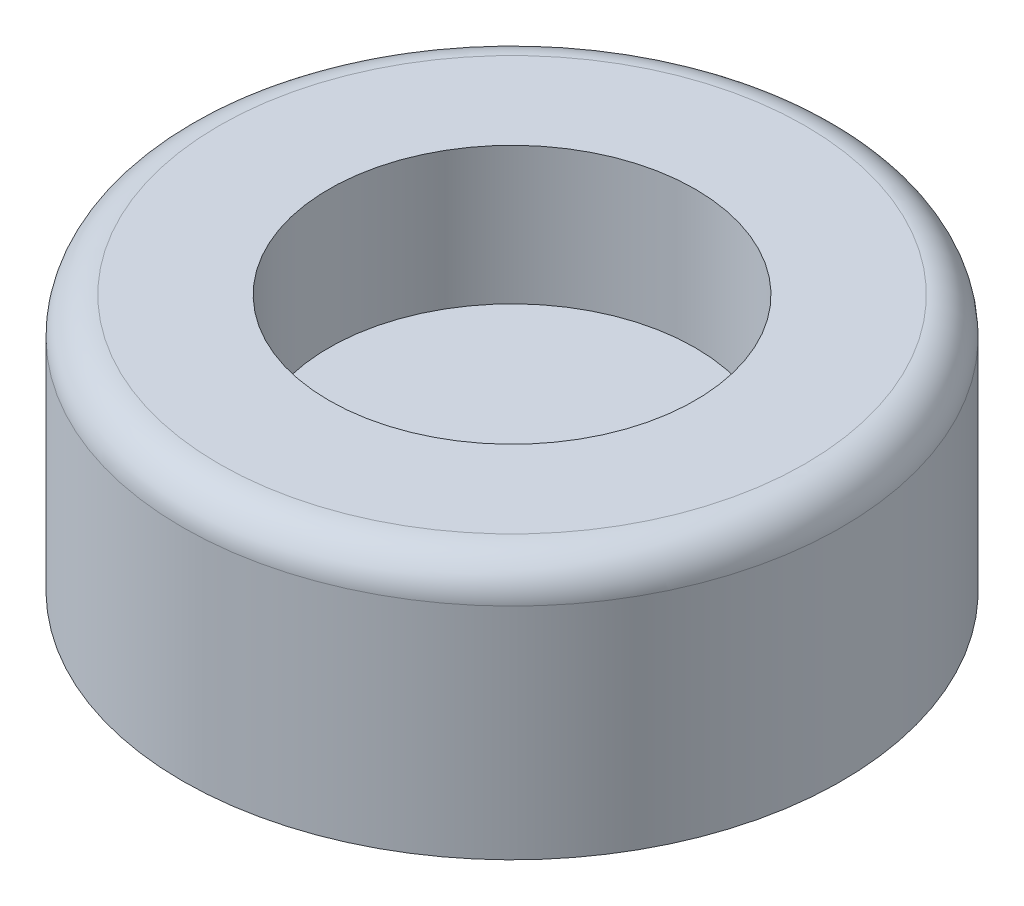
ISO-10303-21;
HEADER;
FILE_DESCRIPTION(('STEP AP214'),'2;1');
FILE_NAME('part.step','',(''),(''),'','','');
FILE_SCHEMA(('AUTOMOTIVE_DESIGN { 1 0 10303 214 1 1 1 1 }'));
ENDSEC;
DATA;
#1=APPLICATION_CONTEXT('core data for automotive mechanical design processes');
#2=APPLICATION_PROTOCOL_DEFINITION('international standard','automotive_design',2000,#1);
#3=PRODUCT_CONTEXT('',#1,'mechanical');
#4=PRODUCT('Part','Part','',(#3));
#5=PRODUCT_RELATED_PRODUCT_CATEGORY('part','',(#4));
#6=PRODUCT_DEFINITION_FORMATION('','',#4);
#7=PRODUCT_DEFINITION_CONTEXT('part definition',#1,'design');
#8=PRODUCT_DEFINITION('design','',#6,#7);
#9=PRODUCT_DEFINITION_SHAPE('','',#8);
#10=(LENGTH_UNIT() NAMED_UNIT(*) SI_UNIT(.MILLI.,.METRE.));
#11=(NAMED_UNIT(*) PLANE_ANGLE_UNIT() SI_UNIT($,.RADIAN.));
#12=(NAMED_UNIT(*) SI_UNIT($,.STERADIAN.) SOLID_ANGLE_UNIT());
#13=UNCERTAINTY_MEASURE_WITH_UNIT(LENGTH_MEASURE(1.E-05),#10,'distance_accuracy_value','');
#14=(GEOMETRIC_REPRESENTATION_CONTEXT(3) GLOBAL_UNCERTAINTY_ASSIGNED_CONTEXT((#13)) GLOBAL_UNIT_ASSIGNED_CONTEXT((#10,
#11,#12)) REPRESENTATION_CONTEXT('',''));
#15=CARTESIAN_POINT('',(0.,0.,0.));
#16=DIRECTION('',(0.,0.,1.));
#17=DIRECTION('',(1.,0.,0.));
#18=AXIS2_PLACEMENT_3D('',#15,#16,#17);
#19=CARTESIAN_POINT('',(0.,8.89,0.));
#20=DIRECTION('',(0.,-1.,0.));
#21=DIRECTION('',(0.,0.,-1.));
#22=AXIS2_PLACEMENT_3D('',#19,#20,#21);
#23=CYLINDRICAL_SURFACE('',#22,11.43);
#24=CARTESIAN_POINT('',(0.,7.62,0.));
#25=DIRECTION('',(0.,1.,0.));
#26=DIRECTION('',(0.,0.,1.));
#27=AXIS2_PLACEMENT_3D('',#24,#25,#26);
#28=CIRCLE('',#27,11.43);
#29=CARTESIAN_POINT('',(0.,7.62,11.43));
#30=VERTEX_POINT('',#29);
#31=EDGE_CURVE('E10',#30,#30,#28,.F.);
#32=ORIENTED_EDGE('',*,*,#31,.T.);
#33=EDGE_LOOP('',(#32));
#34=FACE_BOUND('',#33,.T.);
#35=CARTESIAN_POINT('',(0.,0.,0.));
#36=DIRECTION('',(0.,1.,0.));
#37=DIRECTION('',(0.,0.,1.));
#38=AXIS2_PLACEMENT_3D('',#35,#36,#37);
#39=CIRCLE('',#38,11.43);
#40=CARTESIAN_POINT('',(0.,0.,11.43));
#41=VERTEX_POINT('',#40);
#42=EDGE_CURVE('E50',#41,#41,#39,.T.);
#43=ORIENTED_EDGE('',*,*,#42,.T.);
#44=EDGE_LOOP('',(#43));
#45=FACE_BOUND('',#44,.T.);
#46=ADVANCED_FACE('F37',(#34,#45),#23,.T.);
#47=CARTESIAN_POINT('',(0.,8.89,0.));
#48=DIRECTION('',(0.,1.,0.));
#49=DIRECTION('',(0.,0.,1.));
#50=AXIS2_PLACEMENT_3D('',#47,#48,#49);
#51=PLANE('',#50);
#52=CARTESIAN_POINT('',(0.,8.89,0.));
#53=DIRECTION('',(0.,1.,0.));
#54=DIRECTION('',(0.,0.,1.));
#55=AXIS2_PLACEMENT_3D('',#52,#53,#54);
#56=CIRCLE('',#55,10.16);
#57=CARTESIAN_POINT('',(0.,8.89,10.16));
#58=VERTEX_POINT('',#57);
#59=EDGE_CURVE('E45',#58,#58,#56,.T.);
#60=ORIENTED_EDGE('',*,*,#59,.T.);
#61=EDGE_LOOP('',(#60));
#62=FACE_BOUND('',#61,.T.);
#63=CARTESIAN_POINT('',(0.,8.89,0.));
#64=DIRECTION('',(0.,1.,0.));
#65=DIRECTION('',(0.,0.,1.));
#66=AXIS2_PLACEMENT_3D('',#63,#64,#65);
#67=CIRCLE('',#66,6.35);
#68=CARTESIAN_POINT('',(0.,8.89,6.35));
#69=VERTEX_POINT('',#68);
#70=EDGE_CURVE('E58',#69,#69,#67,.T.);
#71=ORIENTED_EDGE('',*,*,#70,.F.);
#72=EDGE_LOOP('',(#71));
#73=FACE_BOUND('',#72,.T.);
#74=ADVANCED_FACE('F86',(#62,#73),#51,.T.);
#75=CARTESIAN_POINT('',(0.,0.,0.));
#76=DIRECTION('',(0.,1.,0.));
#77=DIRECTION('',(0.,0.,1.));
#78=AXIS2_PLACEMENT_3D('',#75,#76,#77);
#79=PLANE('',#78);
#80=CARTESIAN_POINT('',(0.,0.,0.));
#81=DIRECTION('',(0.,-1.,0.));
#82=DIRECTION('',(0.,0.,-1.));
#83=AXIS2_PLACEMENT_3D('',#80,#81,#82);
#84=CIRCLE('',#83,3.175);
#85=CARTESIAN_POINT('',(0.,0.,-3.175));
#86=VERTEX_POINT('',#85);
#87=EDGE_CURVE('E66',#86,#86,#84,.T.);
#88=ORIENTED_EDGE('',*,*,#87,.F.);
#89=EDGE_LOOP('',(#88));
#90=FACE_BOUND('',#89,.T.);
#91=ORIENTED_EDGE('',*,*,#42,.F.);
#92=EDGE_LOOP('',(#91));
#93=FACE_BOUND('',#92,.T.);
#94=ADVANCED_FACE('F82',(#90,#93),#79,.F.);
#95=CARTESIAN_POINT('',(0.,4.1275,0.));
#96=DIRECTION('',(0.,1.,0.));
#97=DIRECTION('',(0.,0.,1.));
#98=AXIS2_PLACEMENT_3D('',#95,#96,#97);
#99=CYLINDRICAL_SURFACE('',#98,6.35);
#100=CARTESIAN_POINT('',(0.,4.1275,0.));
#101=DIRECTION('',(0.,1.,0.));
#102=DIRECTION('',(0.,0.,1.));
#103=AXIS2_PLACEMENT_3D('',#100,#101,#102);
#104=CIRCLE('',#103,6.35);
#105=CARTESIAN_POINT('',(0.,4.1275,6.35));
#106=VERTEX_POINT('',#105);
#107=EDGE_CURVE('E55',#106,#106,#104,.T.);
#108=CARTESIAN_POINT('',(0.,4.1275,6.35));
#109=CARTESIAN_POINT('',(0.,4.177109375,6.35));
#110=CARTESIAN_POINT('',(0.,4.22671875,6.35));
#111=CARTESIAN_POINT('',(0.,4.3259375,6.35));
#112=CARTESIAN_POINT('',(0.,4.375546875,6.35));
#113=CARTESIAN_POINT('',(0.,4.474765625,6.35));
#114=CARTESIAN_POINT('',(0.,4.524375,6.35));
#115=CARTESIAN_POINT('',(0.,4.62359375,6.35));
#116=CARTESIAN_POINT('',(0.,4.673203125,6.35));
#117=CARTESIAN_POINT('',(0.,4.772421875,6.35));
#118=CARTESIAN_POINT('',(0.,4.82203125,6.35));
#119=CARTESIAN_POINT('',(0.,4.92125,6.35));
#120=CARTESIAN_POINT('',(0.,4.970859375,6.35));
#121=CARTESIAN_POINT('',(0.,5.070078125,6.35));
#122=CARTESIAN_POINT('',(0.,5.1196875,6.35));
#123=CARTESIAN_POINT('',(0.,5.21890625,6.35));
#124=CARTESIAN_POINT('',(0.,5.268515625,6.35));
#125=CARTESIAN_POINT('',(0.,5.367734375,6.35));
#126=CARTESIAN_POINT('',(0.,5.41734375,6.35));
#127=CARTESIAN_POINT('',(0.,5.5165625,6.35));
#128=CARTESIAN_POINT('',(0.,5.566171875,6.35));
#129=CARTESIAN_POINT('',(0.,5.665390625,6.35));
#130=CARTESIAN_POINT('',(0.,5.715,6.35));
#131=CARTESIAN_POINT('',(0.,5.81421875,6.35));
#132=CARTESIAN_POINT('',(0.,5.863828125,6.35));
#133=CARTESIAN_POINT('',(0.,5.963046875,6.35));
#134=CARTESIAN_POINT('',(0.,6.01265625,6.35));
#135=CARTESIAN_POINT('',(0.,6.111875,6.35));
#136=CARTESIAN_POINT('',(0.,6.161484375,6.35));
#137=CARTESIAN_POINT('',(0.,6.260703125,6.35));
#138=CARTESIAN_POINT('',(0.,6.3103125,6.35));
#139=CARTESIAN_POINT('',(0.,6.40953125,6.35));
#140=CARTESIAN_POINT('',(0.,6.459140625,6.35));
#141=CARTESIAN_POINT('',(0.,6.558359375,6.35));
#142=CARTESIAN_POINT('',(0.,6.60796875,6.35));
#143=CARTESIAN_POINT('',(0.,6.7071875,6.35));
#144=CARTESIAN_POINT('',(0.,6.756796875,6.35));
#145=CARTESIAN_POINT('',(0.,6.856015625,6.35));
#146=CARTESIAN_POINT('',(0.,6.905625,6.35));
#147=CARTESIAN_POINT('',(0.,7.00484375,6.35));
#148=CARTESIAN_POINT('',(0.,7.054453125,6.35));
#149=CARTESIAN_POINT('',(0.,7.153671875,6.35));
#150=CARTESIAN_POINT('',(0.,7.20328125,6.35));
#151=CARTESIAN_POINT('',(0.,7.3025,6.35));
#152=CARTESIAN_POINT('',(0.,7.352109375,6.35));
#153=CARTESIAN_POINT('',(0.,7.451328125,6.35));
#154=CARTESIAN_POINT('',(0.,7.5009375,6.35));
#155=CARTESIAN_POINT('',(0.,7.60015625,6.35));
#156=CARTESIAN_POINT('',(0.,7.649765625,6.35));
#157=CARTESIAN_POINT('',(0.,7.748984375,6.35));
#158=CARTESIAN_POINT('',(0.,7.79859375,6.35));
#159=CARTESIAN_POINT('',(0.,7.8978125,6.35));
#160=CARTESIAN_POINT('',(0.,7.947421875,6.35));
#161=CARTESIAN_POINT('',(0.,8.046640625,6.35));
#162=CARTESIAN_POINT('',(0.,8.09625,6.35));
#163=CARTESIAN_POINT('',(0.,8.19546875,6.35));
#164=CARTESIAN_POINT('',(0.,8.245078125,6.35));
#165=CARTESIAN_POINT('',(0.,8.344296875,6.35));
#166=CARTESIAN_POINT('',(0.,8.39390625,6.35));
#167=CARTESIAN_POINT('',(0.,8.493125,6.35));
#168=CARTESIAN_POINT('',(0.,8.542734375,6.35));
#169=CARTESIAN_POINT('',(0.,8.641953125,6.35));
#170=CARTESIAN_POINT('',(0.,8.6915625,6.35));
#171=CARTESIAN_POINT('',(0.,8.79078125,6.35));
#172=CARTESIAN_POINT('',(0.,8.840390625,6.35));
#173=CARTESIAN_POINT('',(0.,8.89,6.35));
#174=B_SPLINE_CURVE_WITH_KNOTS('',3,(#108,#109,#110,#111,#112,#113,#114,#115,#116,#117,#118,
#119,#120,#121,#122,#123,#124,#125,#126,#127,#128,#129,#130,#131,#132,#133,#134,#135,#136,#137,
#138,#139,#140,#141,#142,#143,#144,#145,#146,#147,#148,#149,#150,#151,#152,#153,#154,#155,#156,
#157,#158,#159,#160,#161,#162,#163,#164,#165,#166,#167,#168,#169,#170,#171,#172,#173),
.UNSPECIFIED.,.F.,.F.,(4,2,2,2,2,2,2,2,2,2,2,2,2,2,2,2,2,2,2,2,2,2,2,2,2,2,2,2,2,2,2,2,4),(0.,
0.148828124999999,0.297656249999999,0.446484374999999,0.595312499999999,0.744140625,0.89296875,
1.041796875,1.190625,1.339453125,1.48828125,1.637109375,1.7859375,1.934765625,2.08359375,
2.232421875,2.38125,2.530078125,2.67890625,2.827734375,2.9765625,3.125390625,3.27421875,
3.423046875,3.571875,3.720703125,3.86953125,4.018359375,4.1671875,4.316015625,4.46484375,
4.613671875,4.7625),.UNSPECIFIED.);
#175=EDGE_CURVE('BSEAM85',#106,#69,#174,.T.);
#176=ORIENTED_EDGE('',*,*,#107,.F.);
#177=ORIENTED_EDGE('',*,*,#70,.T.);
#178=ORIENTED_EDGE('',*,*,#175,.T.);
#179=ORIENTED_EDGE('',*,*,#175,.F.);
#180=EDGE_LOOP('',(#176,#178,#177,#179));
#181=FACE_BOUND('',#180,.T.);
#182=ADVANCED_FACE('F85',(#181),#99,.F.);
#183=CARTESIAN_POINT('',(0.,4.1275,0.));
#184=DIRECTION('',(0.,1.,0.));
#185=DIRECTION('',(0.,0.,1.));
#186=AXIS2_PLACEMENT_3D('',#183,#184,#185);
#187=PLANE('',#186);
#188=ORIENTED_EDGE('',*,*,#107,.T.);
#189=EDGE_LOOP('',(#188));
#190=FACE_BOUND('',#189,.T.);
#191=ADVANCED_FACE('F98',(#190),#187,.T.);
#192=CARTESIAN_POINT('',(0.,7.62,0.));
#193=DIRECTION('',(0.,1.,0.));
#194=DIRECTION('',(0.,0.,1.));
#195=AXIS2_PLACEMENT_3D('',#192,#193,#194);
#196=TOROIDAL_SURFACE('',#195,10.16,1.27);
#197=ORIENTED_EDGE('',*,*,#31,.F.);
#198=EDGE_LOOP('',(#197));
#199=FACE_BOUND('',#198,.T.);
#200=ORIENTED_EDGE('',*,*,#59,.F.);
#201=EDGE_LOOP('',(#200));
#202=FACE_BOUND('',#201,.T.);
#203=ADVANCED_FACE('F39',(#199,#202),#196,.T.);
#204=CARTESIAN_POINT('',(0.,2.54,0.));
#205=DIRECTION('',(0.,-1.,0.));
#206=DIRECTION('',(0.,0.,-1.));
#207=AXIS2_PLACEMENT_3D('',#204,#205,#206);
#208=CYLINDRICAL_SURFACE('',#207,3.175);
#209=CARTESIAN_POINT('',(0.,2.54,0.));
#210=DIRECTION('',(0.,-1.,0.));
#211=DIRECTION('',(0.,0.,-1.));
#212=AXIS2_PLACEMENT_3D('',#209,#210,#211);
#213=CIRCLE('',#212,3.175);
#214=CARTESIAN_POINT('',(0.,2.54,-3.175));
#215=VERTEX_POINT('',#214);
#216=EDGE_CURVE('E62',#215,#215,#213,.T.);
#217=ORIENTED_EDGE('',*,*,#216,.F.);
#218=EDGE_LOOP('',(#217));
#219=FACE_BOUND('',#218,.T.);
#220=ORIENTED_EDGE('',*,*,#87,.T.);
#221=EDGE_LOOP('',(#220));
#222=FACE_BOUND('',#221,.T.);
#223=ADVANCED_FACE('F76',(#219,#222),#208,.F.);
#224=CARTESIAN_POINT('',(0.,2.54,0.));
#225=DIRECTION('',(0.,-1.,0.));
#226=DIRECTION('',(0.,0.,-1.));
#227=AXIS2_PLACEMENT_3D('',#224,#225,#226);
#228=PLANE('',#227);
#229=ORIENTED_EDGE('',*,*,#216,.T.);
#230=EDGE_LOOP('',(#229));
#231=FACE_BOUND('',#230,.T.);
#232=ADVANCED_FACE('F74',(#231),#228,.T.);
#233=CLOSED_SHELL('',(#46,#74,#94,#182,#191,#203,#223,#232));
#234=MANIFOLD_SOLID_BREP('B2',#233);
#235=ADVANCED_BREP_SHAPE_REPRESENTATION('',(#18,#234),#14);
#236=SHAPE_DEFINITION_REPRESENTATION(#9,#235);
ENDSEC;
END-ISO-10303-21;
